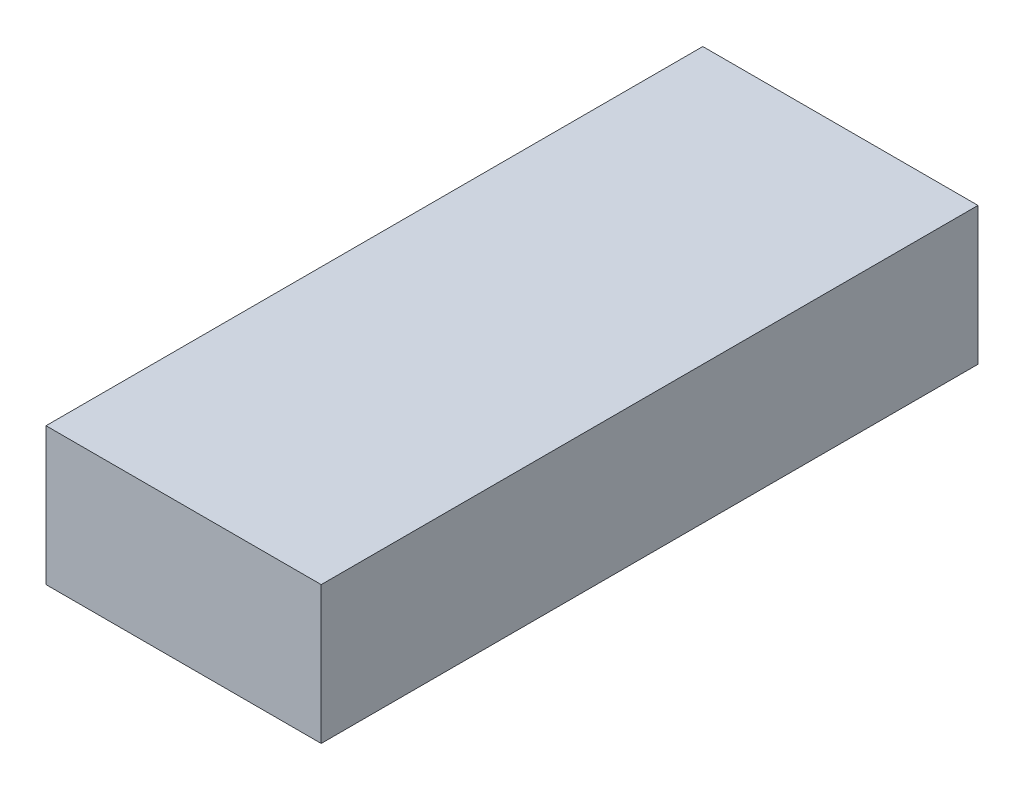
ISO-10303-21;
HEADER;
FILE_DESCRIPTION(('STEP AP214'),'2;1');
FILE_NAME('part.step','',(''),(''),'','','');
FILE_SCHEMA(('AUTOMOTIVE_DESIGN { 1 0 10303 214 1 1 1 1 }'));
ENDSEC;
DATA;
#1=APPLICATION_CONTEXT('core data for automotive mechanical design processes');
#2=APPLICATION_PROTOCOL_DEFINITION('international standard','automotive_design',2000,#1);
#3=PRODUCT_CONTEXT('',#1,'mechanical');
#4=PRODUCT('Part','Part','',(#3));
#5=PRODUCT_RELATED_PRODUCT_CATEGORY('part','',(#4));
#6=PRODUCT_DEFINITION_FORMATION('','',#4);
#7=PRODUCT_DEFINITION_CONTEXT('part definition',#1,'design');
#8=PRODUCT_DEFINITION('design','',#6,#7);
#9=PRODUCT_DEFINITION_SHAPE('','',#8);
#10=(LENGTH_UNIT() NAMED_UNIT(*) SI_UNIT(.MILLI.,.METRE.));
#11=(NAMED_UNIT(*) PLANE_ANGLE_UNIT() SI_UNIT($,.RADIAN.));
#12=(NAMED_UNIT(*) SI_UNIT($,.STERADIAN.) SOLID_ANGLE_UNIT());
#13=UNCERTAINTY_MEASURE_WITH_UNIT(LENGTH_MEASURE(1.E-05),#10,'distance_accuracy_value','');
#14=(GEOMETRIC_REPRESENTATION_CONTEXT(3) GLOBAL_UNCERTAINTY_ASSIGNED_CONTEXT((#13)) GLOBAL_UNIT_ASSIGNED_CONTEXT((#10,
#11,#12)) REPRESENTATION_CONTEXT('',''));
#15=CARTESIAN_POINT('',(0.,0.,0.));
#16=DIRECTION('',(0.,0.,1.));
#17=DIRECTION('',(1.,0.,0.));
#18=AXIS2_PLACEMENT_3D('',#15,#16,#17);
#19=CARTESIAN_POINT('',(30.,-15.,71.60006));
#20=DIRECTION('',(-1.,0.,0.));
#21=DIRECTION('',(0.,0.,1.));
#22=AXIS2_PLACEMENT_3D('',#19,#20,#21);
#23=PLANE('',#22);
#24=DIRECTION('',(0.,1.,0.));
#25=VECTOR('',#24,1.);
#26=CARTESIAN_POINT('',(30.,-15.,-71.60006));
#27=LINE('',#26,#25);
#28=CARTESIAN_POINT('',(30.,-15.,-71.60006));
#29=VERTEX_POINT('',#28);
#30=CARTESIAN_POINT('',(30.,15.,-71.60006));
#31=VERTEX_POINT('',#30);
#32=EDGE_CURVE('E107',#29,#31,#27,.T.);
#33=ORIENTED_EDGE('',*,*,#32,.T.);
#34=DIRECTION('',(0.,0.,-1.));
#35=VECTOR('',#34,1.);
#36=CARTESIAN_POINT('',(30.,15.,71.60006));
#37=LINE('',#36,#35);
#38=CARTESIAN_POINT('',(30.,15.,71.60006));
#39=VERTEX_POINT('',#38);
#40=EDGE_CURVE('E11',#39,#31,#37,.T.);
#41=ORIENTED_EDGE('',*,*,#40,.F.);
#42=DIRECTION('',(0.,1.,0.));
#43=VECTOR('',#42,1.);
#44=CARTESIAN_POINT('',(30.,-15.,71.60006));
#45=LINE('',#44,#43);
#46=CARTESIAN_POINT('',(30.,-15.,71.60006));
#47=VERTEX_POINT('',#46);
#48=EDGE_CURVE('E91',#47,#39,#45,.T.);
#49=ORIENTED_EDGE('',*,*,#48,.F.);
#50=DIRECTION('',(0.,0.,-1.));
#51=VECTOR('',#50,1.);
#52=CARTESIAN_POINT('',(30.,-15.,71.60006));
#53=LINE('',#52,#51);
#54=EDGE_CURVE('E103',#47,#29,#53,.T.);
#55=ORIENTED_EDGE('',*,*,#54,.T.);
#56=EDGE_LOOP('',(#33,#41,#49,#55));
#57=FACE_BOUND('',#56,.T.);
#58=ADVANCED_FACE('F39',(#57),#23,.F.);
#59=CARTESIAN_POINT('',(-30.,15.,71.60006));
#60=DIRECTION('',(0.,-1.,0.));
#61=DIRECTION('',(0.,0.,-1.));
#62=AXIS2_PLACEMENT_3D('',#59,#60,#61);
#63=PLANE('',#62);
#64=DIRECTION('',(-1.,0.,0.));
#65=VECTOR('',#64,1.);
#66=CARTESIAN_POINT('',(-30.,15.,-71.60006));
#67=LINE('',#66,#65);
#68=CARTESIAN_POINT('',(-30.,15.,-71.60006));
#69=VERTEX_POINT('',#68);
#70=EDGE_CURVE('E96',#31,#69,#67,.T.);
#71=ORIENTED_EDGE('',*,*,#70,.T.);
#72=DIRECTION('',(0.,0.,-1.));
#73=VECTOR('',#72,1.);
#74=CARTESIAN_POINT('',(-30.,15.,71.60006));
#75=LINE('',#74,#73);
#76=CARTESIAN_POINT('',(-30.,15.,71.60006));
#77=VERTEX_POINT('',#76);
#78=EDGE_CURVE('E48',#77,#69,#75,.T.);
#79=ORIENTED_EDGE('',*,*,#78,.F.);
#80=DIRECTION('',(-1.,0.,0.));
#81=VECTOR('',#80,1.);
#82=CARTESIAN_POINT('',(-30.,15.,71.60006));
#83=LINE('',#82,#81);
#84=EDGE_CURVE('E86',#39,#77,#83,.T.);
#85=ORIENTED_EDGE('',*,*,#84,.F.);
#86=ORIENTED_EDGE('',*,*,#40,.T.);
#87=EDGE_LOOP('',(#71,#79,#85,#86));
#88=FACE_BOUND('',#87,.T.);
#89=ADVANCED_FACE('F95',(#88),#63,.F.);
#90=CARTESIAN_POINT('',(-30.,-15.,71.60006));
#91=DIRECTION('',(1.,0.,0.));
#92=DIRECTION('',(0.,0.,-1.));
#93=AXIS2_PLACEMENT_3D('',#90,#91,#92);
#94=PLANE('',#93);
#95=DIRECTION('',(0.,-1.,0.));
#96=VECTOR('',#95,1.);
#97=CARTESIAN_POINT('',(-30.,-15.,-71.60006));
#98=LINE('',#97,#96);
#99=CARTESIAN_POINT('',(-30.,-15.,-71.60006));
#100=VERTEX_POINT('',#99);
#101=EDGE_CURVE('E73',#69,#100,#98,.T.);
#102=ORIENTED_EDGE('',*,*,#101,.T.);
#103=DIRECTION('',(0.,0.,-1.));
#104=VECTOR('',#103,1.);
#105=CARTESIAN_POINT('',(-30.,-15.,71.60006));
#106=LINE('',#105,#104);
#107=CARTESIAN_POINT('',(-30.,-15.,71.60006));
#108=VERTEX_POINT('',#107);
#109=EDGE_CURVE('E98',#108,#100,#106,.T.);
#110=ORIENTED_EDGE('',*,*,#109,.F.);
#111=DIRECTION('',(0.,-1.,0.));
#112=VECTOR('',#111,1.);
#113=CARTESIAN_POINT('',(-30.,-15.,71.60006));
#114=LINE('',#113,#112);
#115=EDGE_CURVE('E89',#77,#108,#114,.T.);
#116=ORIENTED_EDGE('',*,*,#115,.F.);
#117=ORIENTED_EDGE('',*,*,#78,.T.);
#118=EDGE_LOOP('',(#102,#110,#116,#117));
#119=FACE_BOUND('',#118,.T.);
#120=ADVANCED_FACE('F99',(#119),#94,.F.);
#121=CARTESIAN_POINT('',(-30.,-15.,71.60006));
#122=DIRECTION('',(0.,1.,0.));
#123=DIRECTION('',(0.,0.,1.));
#124=AXIS2_PLACEMENT_3D('',#121,#122,#123);
#125=PLANE('',#124);
#126=DIRECTION('',(1.,0.,0.));
#127=VECTOR('',#126,1.);
#128=CARTESIAN_POINT('',(-30.,-15.,-71.60006));
#129=LINE('',#128,#127);
#130=EDGE_CURVE('E79',#100,#29,#129,.T.);
#131=ORIENTED_EDGE('',*,*,#130,.T.);
#132=ORIENTED_EDGE('',*,*,#54,.F.);
#133=DIRECTION('',(1.,0.,0.));
#134=VECTOR('',#133,1.);
#135=CARTESIAN_POINT('',(-30.,-15.,71.60006));
#136=LINE('',#135,#134);
#137=EDGE_CURVE('E56',#108,#47,#136,.T.);
#138=ORIENTED_EDGE('',*,*,#137,.F.);
#139=ORIENTED_EDGE('',*,*,#109,.T.);
#140=EDGE_LOOP('',(#131,#132,#138,#139));
#141=FACE_BOUND('',#140,.T.);
#142=ADVANCED_FACE('F120',(#141),#125,.F.);
#143=CARTESIAN_POINT('',(0.,0.,71.60006));
#144=DIRECTION('',(0.,0.,-1.));
#145=DIRECTION('',(-1.,0.,0.));
#146=AXIS2_PLACEMENT_3D('',#143,#144,#145);
#147=PLANE('',#146);
#148=ORIENTED_EDGE('',*,*,#48,.T.);
#149=ORIENTED_EDGE('',*,*,#84,.T.);
#150=ORIENTED_EDGE('',*,*,#115,.T.);
#151=ORIENTED_EDGE('',*,*,#137,.T.);
#152=EDGE_LOOP('',(#148,#149,#150,#151));
#153=FACE_BOUND('',#152,.T.);
#154=ADVANCED_FACE('F87',(#153),#147,.F.);
#155=CARTESIAN_POINT('',(0.,0.,-71.60006));
#156=DIRECTION('',(0.,0.,-1.));
#157=DIRECTION('',(-1.,0.,0.));
#158=AXIS2_PLACEMENT_3D('',#155,#156,#157);
#159=PLANE('',#158);
#160=ORIENTED_EDGE('',*,*,#32,.F.);
#161=ORIENTED_EDGE('',*,*,#130,.F.);
#162=ORIENTED_EDGE('',*,*,#101,.F.);
#163=ORIENTED_EDGE('',*,*,#70,.F.);
#164=EDGE_LOOP('',(#160,#161,#162,#163));
#165=FACE_BOUND('',#164,.T.);
#166=ADVANCED_FACE('F123',(#165),#159,.T.);
#167=CLOSED_SHELL('',(#58,#89,#120,#142,#154,#166));
#168=MANIFOLD_SOLID_BREP('B2',#167);
#169=ADVANCED_BREP_SHAPE_REPRESENTATION('',(#18,#168),#14);
#170=SHAPE_DEFINITION_REPRESENTATION(#9,#169);
ENDSEC;
END-ISO-10303-21;
